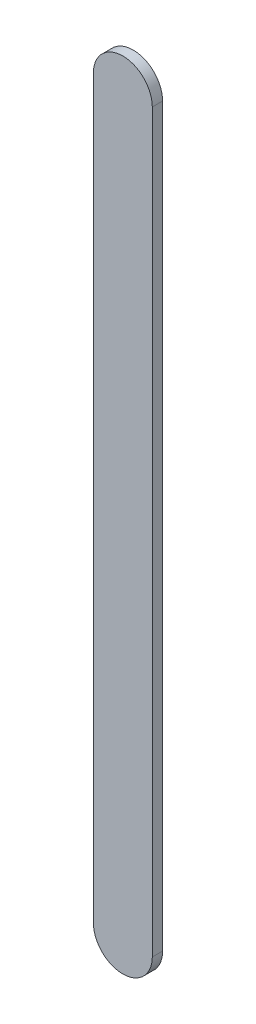
ISO-10303-21;
HEADER;
FILE_DESCRIPTION(('STEP AP214'),'2;1');
FILE_NAME('part.step','',(''),(''),'','','');
FILE_SCHEMA(('AUTOMOTIVE_DESIGN { 1 0 10303 214 1 1 1 1 }'));
ENDSEC;
DATA;
#1=APPLICATION_CONTEXT('core data for automotive mechanical design processes');
#2=APPLICATION_PROTOCOL_DEFINITION('international standard','automotive_design',2000,#1);
#3=PRODUCT_CONTEXT('',#1,'mechanical');
#4=PRODUCT('Part','Part','',(#3));
#5=PRODUCT_RELATED_PRODUCT_CATEGORY('part','',(#4));
#6=PRODUCT_DEFINITION_FORMATION('','',#4);
#7=PRODUCT_DEFINITION_CONTEXT('part definition',#1,'design');
#8=PRODUCT_DEFINITION('design','',#6,#7);
#9=PRODUCT_DEFINITION_SHAPE('','',#8);
#10=(LENGTH_UNIT() NAMED_UNIT(*) SI_UNIT(.MILLI.,.METRE.));
#11=(NAMED_UNIT(*) PLANE_ANGLE_UNIT() SI_UNIT($,.RADIAN.));
#12=(NAMED_UNIT(*) SI_UNIT($,.STERADIAN.) SOLID_ANGLE_UNIT());
#13=UNCERTAINTY_MEASURE_WITH_UNIT(LENGTH_MEASURE(1.E-05),#10,'distance_accuracy_value','');
#14=(GEOMETRIC_REPRESENTATION_CONTEXT(3) GLOBAL_UNCERTAINTY_ASSIGNED_CONTEXT((#13)) GLOBAL_UNIT_ASSIGNED_CONTEXT((#10,
#11,#12)) REPRESENTATION_CONTEXT('',''));
#15=CARTESIAN_POINT('',(0.,0.,0.));
#16=DIRECTION('',(0.,0.,1.));
#17=DIRECTION('',(1.,0.,0.));
#18=AXIS2_PLACEMENT_3D('',#15,#16,#17);
#19=CARTESIAN_POINT('',(82.85,-117.35,1.635));
#20=DIRECTION('',(0.,0.,1.));
#21=DIRECTION('',(1.,0.,0.));
#22=AXIS2_PLACEMENT_3D('',#19,#20,#21);
#23=PLANE('',#22);
#24=DIRECTION('',(0.,-1.,0.));
#25=VECTOR('',#24,1.);
#26=CARTESIAN_POINT('',(82.85,-117.35,1.635));
#27=LINE('',#26,#25);
#28=CARTESIAN_POINT('',(82.85,-117.35,1.635));
#29=VERTEX_POINT('',#28);
#30=CARTESIAN_POINT('',(82.85,-119.85,1.635));
#31=VERTEX_POINT('',#30);
#32=EDGE_CURVE('E98',#29,#31,#27,.T.);
#33=ORIENTED_EDGE('',*,*,#32,.T.);
#34=CARTESIAN_POINT('',(82.95,-119.85,1.635));
#35=DIRECTION('',(0.,0.,1.));
#36=DIRECTION('',(-1.,1.42108547152E-13,0.));
#37=AXIS2_PLACEMENT_3D('',#34,#35,#36);
#38=CIRCLE('',#37,0.1);
#39=CARTESIAN_POINT('',(83.05,-119.85,1.635));
#40=VERTEX_POINT('',#39);
#41=EDGE_CURVE('E77',#31,#40,#38,.T.);
#42=ORIENTED_EDGE('',*,*,#41,.T.);
#43=DIRECTION('',(0.,1.,0.));
#44=VECTOR('',#43,1.);
#45=CARTESIAN_POINT('',(83.05,-119.85,1.635));
#46=LINE('',#45,#44);
#47=CARTESIAN_POINT('',(83.05,-117.35,1.635));
#48=VERTEX_POINT('',#47);
#49=EDGE_CURVE('E82',#40,#48,#46,.T.);
#50=ORIENTED_EDGE('',*,*,#49,.T.);
#51=CARTESIAN_POINT('',(82.95,-117.35,1.635));
#52=DIRECTION('',(0.,0.,1.));
#53=DIRECTION('',(1.,0.,0.));
#54=AXIS2_PLACEMENT_3D('',#51,#52,#53);
#55=CIRCLE('',#54,0.1);
#56=EDGE_CURVE('E11',#48,#29,#55,.T.);
#57=ORIENTED_EDGE('',*,*,#56,.T.);
#58=EDGE_LOOP('',(#33,#42,#50,#57));
#59=FACE_BOUND('',#58,.T.);
#60=ADVANCED_FACE('F17',(#59),#23,.T.);
#61=CARTESIAN_POINT('',(82.85,-117.35,1.6));
#62=DIRECTION('',(0.,0.,1.));
#63=DIRECTION('',(1.,0.,0.));
#64=AXIS2_PLACEMENT_3D('',#61,#62,#63);
#65=PLANE('',#64);
#66=CARTESIAN_POINT('',(82.95,-117.35,1.6));
#67=DIRECTION('',(0.,0.,1.));
#68=DIRECTION('',(1.,0.,0.));
#69=AXIS2_PLACEMENT_3D('',#66,#67,#68);
#70=CIRCLE('',#69,0.1);
#71=CARTESIAN_POINT('',(83.05,-117.35,1.6));
#72=VERTEX_POINT('',#71);
#73=CARTESIAN_POINT('',(82.85,-117.35,1.6));
#74=VERTEX_POINT('',#73);
#75=EDGE_CURVE('E21',#72,#74,#70,.T.);
#76=ORIENTED_EDGE('',*,*,#75,.F.);
#77=DIRECTION('',(0.,1.,0.));
#78=VECTOR('',#77,1.);
#79=CARTESIAN_POINT('',(83.05,-119.85,1.6));
#80=LINE('',#79,#78);
#81=CARTESIAN_POINT('',(83.05,-119.85,1.6));
#82=VERTEX_POINT('',#81);
#83=EDGE_CURVE('E68',#82,#72,#80,.T.);
#84=ORIENTED_EDGE('',*,*,#83,.F.);
#85=CARTESIAN_POINT('',(82.95,-119.85,1.6));
#86=DIRECTION('',(0.,0.,1.));
#87=DIRECTION('',(-1.,1.42108547152E-13,0.));
#88=AXIS2_PLACEMENT_3D('',#85,#86,#87);
#89=CIRCLE('',#88,0.1);
#90=CARTESIAN_POINT('',(82.85,-119.85,1.6));
#91=VERTEX_POINT('',#90);
#92=EDGE_CURVE('E71',#91,#82,#89,.T.);
#93=ORIENTED_EDGE('',*,*,#92,.F.);
#94=DIRECTION('',(0.,-1.,0.));
#95=VECTOR('',#94,1.);
#96=CARTESIAN_POINT('',(82.85,-117.35,1.6));
#97=LINE('',#96,#95);
#98=EDGE_CURVE('E115',#74,#91,#97,.T.);
#99=ORIENTED_EDGE('',*,*,#98,.F.);
#100=EDGE_LOOP('',(#76,#84,#93,#99));
#101=FACE_BOUND('',#100,.T.);
#102=ADVANCED_FACE('F19',(#101),#65,.F.);
#103=CARTESIAN_POINT('',(82.95,-117.35,1.6));
#104=DIRECTION('',(0.,0.,-1.));
#105=DIRECTION('',(1.,0.,0.));
#106=AXIS2_PLACEMENT_3D('',#103,#104,#105);
#107=CYLINDRICAL_SURFACE('',#106,0.1);
#108=ORIENTED_EDGE('',*,*,#75,.T.);
#109=DIRECTION('',(0.,0.,1.));
#110=VECTOR('',#109,1.);
#111=CARTESIAN_POINT('',(82.85,-117.35,1.6));
#112=LINE('',#111,#110);
#113=EDGE_CURVE('E92',#74,#29,#112,.T.);
#114=ORIENTED_EDGE('',*,*,#113,.T.);
#115=ORIENTED_EDGE('',*,*,#56,.F.);
#116=DIRECTION('',(0.,0.,1.));
#117=VECTOR('',#116,1.);
#118=CARTESIAN_POINT('',(83.05,-117.35,1.6));
#119=LINE('',#118,#117);
#120=EDGE_CURVE('E76',#72,#48,#119,.T.);
#121=ORIENTED_EDGE('',*,*,#120,.F.);
#122=EDGE_LOOP('',(#108,#114,#115,#121));
#123=FACE_BOUND('',#122,.T.);
#124=ADVANCED_FACE('F111',(#123),#107,.T.);
#125=CARTESIAN_POINT('',(83.05,-119.85,1.6));
#126=DIRECTION('',(-1.,0.,0.));
#127=DIRECTION('',(0.,0.,1.));
#128=AXIS2_PLACEMENT_3D('',#125,#126,#127);
#129=PLANE('',#128);
#130=ORIENTED_EDGE('',*,*,#83,.T.);
#131=ORIENTED_EDGE('',*,*,#120,.T.);
#132=ORIENTED_EDGE('',*,*,#49,.F.);
#133=DIRECTION('',(0.,0.,1.));
#134=VECTOR('',#133,1.);
#135=CARTESIAN_POINT('',(83.05,-119.85,1.6));
#136=LINE('',#135,#134);
#137=EDGE_CURVE('E80',#82,#40,#136,.T.);
#138=ORIENTED_EDGE('',*,*,#137,.F.);
#139=EDGE_LOOP('',(#130,#131,#132,#138));
#140=FACE_BOUND('',#139,.T.);
#141=ADVANCED_FACE('F81',(#140),#129,.F.);
#142=CARTESIAN_POINT('',(82.95,-119.85,1.6));
#143=DIRECTION('',(0.,0.,-1.));
#144=DIRECTION('',(-1.,1.42108547152E-13,0.));
#145=AXIS2_PLACEMENT_3D('',#142,#143,#144);
#146=CYLINDRICAL_SURFACE('',#145,0.1);
#147=ORIENTED_EDGE('',*,*,#92,.T.);
#148=ORIENTED_EDGE('',*,*,#137,.T.);
#149=ORIENTED_EDGE('',*,*,#41,.F.);
#150=DIRECTION('',(0.,0.,1.));
#151=VECTOR('',#150,1.);
#152=CARTESIAN_POINT('',(82.85,-119.85,1.6));
#153=LINE('',#152,#151);
#154=EDGE_CURVE('E89',#91,#31,#153,.T.);
#155=ORIENTED_EDGE('',*,*,#154,.F.);
#156=EDGE_LOOP('',(#147,#148,#149,#155));
#157=FACE_BOUND('',#156,.T.);
#158=ADVANCED_FACE('F87',(#157),#146,.T.);
#159=CARTESIAN_POINT('',(82.85,-117.35,1.6));
#160=DIRECTION('',(1.,0.,0.));
#161=DIRECTION('',(0.,1.,0.));
#162=AXIS2_PLACEMENT_3D('',#159,#160,#161);
#163=PLANE('',#162);
#164=ORIENTED_EDGE('',*,*,#98,.T.);
#165=ORIENTED_EDGE('',*,*,#154,.T.);
#166=ORIENTED_EDGE('',*,*,#32,.F.);
#167=ORIENTED_EDGE('',*,*,#113,.F.);
#168=EDGE_LOOP('',(#164,#165,#166,#167));
#169=FACE_BOUND('',#168,.T.);
#170=ADVANCED_FACE('F114',(#169),#163,.F.);
#171=CLOSED_SHELL('',(#60,#102,#124,#141,#158,#170));
#172=MANIFOLD_SOLID_BREP('B1',#171);
#173=ADVANCED_BREP_SHAPE_REPRESENTATION('',(#18,#172),#14);
#174=SHAPE_DEFINITION_REPRESENTATION(#9,#173);
ENDSEC;
END-ISO-10303-21;
